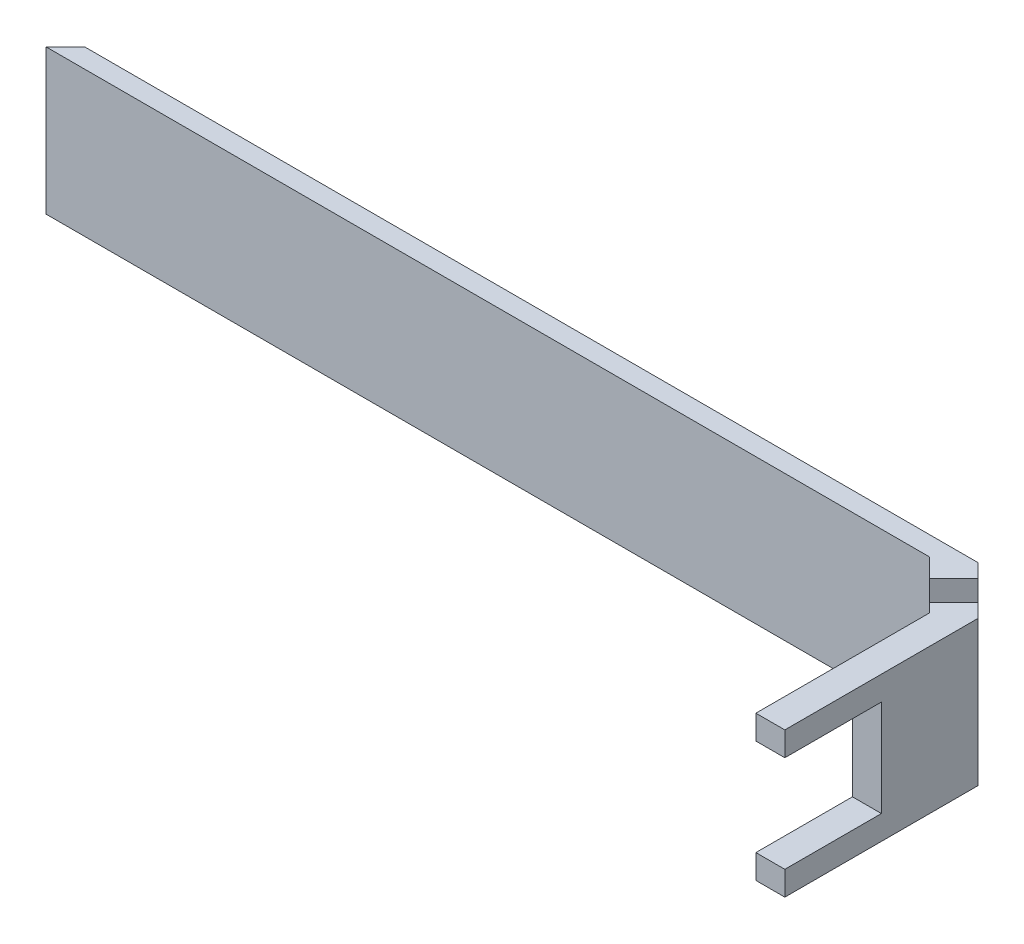
ISO-10303-21;
HEADER;
FILE_DESCRIPTION(('STEP AP214'),'2;1');
FILE_NAME('part.step','',(''),(''),'','','');
FILE_SCHEMA(('AUTOMOTIVE_DESIGN { 1 0 10303 214 1 1 1 1 }'));
ENDSEC;
DATA;
#1=APPLICATION_CONTEXT('core data for automotive mechanical design processes');
#2=APPLICATION_PROTOCOL_DEFINITION('international standard','automotive_design',2000,#1);
#3=PRODUCT_CONTEXT('',#1,'mechanical');
#4=PRODUCT('Part','Part','',(#3));
#5=PRODUCT_RELATED_PRODUCT_CATEGORY('part','',(#4));
#6=PRODUCT_DEFINITION_FORMATION('','',#4);
#7=PRODUCT_DEFINITION_CONTEXT('part definition',#1,'design');
#8=PRODUCT_DEFINITION('design','',#6,#7);
#9=PRODUCT_DEFINITION_SHAPE('','',#8);
#10=(LENGTH_UNIT() NAMED_UNIT(*) SI_UNIT(.MILLI.,.METRE.));
#11=(NAMED_UNIT(*) PLANE_ANGLE_UNIT() SI_UNIT($,.RADIAN.));
#12=(NAMED_UNIT(*) SI_UNIT($,.STERADIAN.) SOLID_ANGLE_UNIT());
#13=UNCERTAINTY_MEASURE_WITH_UNIT(LENGTH_MEASURE(1.E-05),#10,'distance_accuracy_value','');
#14=(GEOMETRIC_REPRESENTATION_CONTEXT(3) GLOBAL_UNCERTAINTY_ASSIGNED_CONTEXT((#13)) GLOBAL_UNIT_ASSIGNED_CONTEXT((#10,
#11,#12)) REPRESENTATION_CONTEXT('',''));
#15=CARTESIAN_POINT('',(0.,0.,0.));
#16=DIRECTION('',(0.,0.,1.));
#17=DIRECTION('',(1.,0.,0.));
#18=AXIS2_PLACEMENT_3D('',#15,#16,#17);
#19=CARTESIAN_POINT('',(0.,15.,0.));
#20=DIRECTION('',(0.,-1.,0.));
#21=DIRECTION('',(0.,0.,-1.));
#22=AXIS2_PLACEMENT_3D('',#19,#20,#21);
#23=PLANE('',#22);
#24=DIRECTION('',(0.707106781186544,0.,0.707106781186551));
#25=VECTOR('',#24,1.);
#26=CARTESIAN_POINT('',(46.5,15.,-13.5));
#27=LINE('',#26,#25);
#28=CARTESIAN_POINT('',(51.5,15.,-8.49999999999997));
#29=VERTEX_POINT('',#28);
#30=CARTESIAN_POINT('',(50.0606601717798,15.,-9.93933982822017));
#31=VERTEX_POINT('',#30);
#32=EDGE_CURVE('E213',#29,#31,#27,.F.);
#33=ORIENTED_EDGE('',*,*,#32,.T.);
#34=DIRECTION('',(0.707106781186551,0.,-0.707106781186544));
#35=VECTOR('',#34,1.);
#36=CARTESIAN_POINT('',(44.5606601717798,15.,-4.43933982822018));
#37=LINE('',#36,#35);
#38=CARTESIAN_POINT('',(47.5606601717798,15.,-7.43933982822017));
#39=VERTEX_POINT('',#38);
#40=EDGE_CURVE('E345',#39,#31,#37,.T.);
#41=ORIENTED_EDGE('',*,*,#40,.F.);
#42=DIRECTION('',(-0.707106781186544,0.,-0.707106781186551));
#43=VECTOR('',#42,1.);
#44=CARTESIAN_POINT('',(27.5000000000002,15.,-27.5));
#45=LINE('',#44,#43);
#46=CARTESIAN_POINT('',(48.5,15.,-6.49999999999997));
#47=VERTEX_POINT('',#46);
#48=EDGE_CURVE('E209',#39,#47,#45,.F.);
#49=ORIENTED_EDGE('',*,*,#48,.T.);
#50=DIRECTION('',(0.,0.,1.));
#51=VECTOR('',#50,1.);
#52=CARTESIAN_POINT('',(48.5,15.,11.5));
#53=LINE('',#52,#51);
#54=CARTESIAN_POINT('',(48.5,15.,11.5));
#55=VERTEX_POINT('',#54);
#56=EDGE_CURVE('E293',#47,#55,#53,.T.);
#57=ORIENTED_EDGE('',*,*,#56,.T.);
#58=DIRECTION('',(1.,0.,0.));
#59=VECTOR('',#58,1.);
#60=CARTESIAN_POINT('',(51.5,15.,11.5));
#61=LINE('',#60,#59);
#62=CARTESIAN_POINT('',(51.5,15.,11.5));
#63=VERTEX_POINT('',#62);
#64=EDGE_CURVE('E244',#55,#63,#61,.T.);
#65=ORIENTED_EDGE('',*,*,#64,.T.);
#66=DIRECTION('',(0.,0.,-1.));
#67=VECTOR('',#66,1.);
#68=CARTESIAN_POINT('',(51.5,15.,-13.5));
#69=LINE('',#68,#67);
#70=EDGE_CURVE('E239',#63,#29,#69,.T.);
#71=ORIENTED_EDGE('',*,*,#70,.T.);
#72=EDGE_LOOP('',(#33,#41,#49,#57,#65,#71));
#73=FACE_BOUND('',#72,.T.);
#74=ADVANCED_FACE('F37',(#73),#23,.F.);
#75=CARTESIAN_POINT('',(0.,0.,0.));
#76=DIRECTION('',(0.,-1.,0.));
#77=DIRECTION('',(0.,0.,-1.));
#78=AXIS2_PLACEMENT_3D('',#75,#76,#77);
#79=PLANE('',#78);
#80=DIRECTION('',(0.707106781186551,0.,-0.707106781186544));
#81=VECTOR('',#80,1.);
#82=CARTESIAN_POINT('',(44.5606601717798,0.,-4.43933982822018));
#83=LINE('',#82,#81);
#84=CARTESIAN_POINT('',(47.5606601717798,0.,-7.43933982822017));
#85=VERTEX_POINT('',#84);
#86=CARTESIAN_POINT('',(50.0606601717798,0.,-9.93933982822017));
#87=VERTEX_POINT('',#86);
#88=EDGE_CURVE('E178',#85,#87,#83,.T.);
#89=ORIENTED_EDGE('',*,*,#88,.T.);
#90=DIRECTION('',(-0.707106781186544,0.,-0.707106781186551));
#91=VECTOR('',#90,1.);
#92=CARTESIAN_POINT('',(30.0000000000002,0.,-29.9999999999999));
#93=LINE('',#92,#91);
#94=CARTESIAN_POINT('',(51.5,0.,-8.49999999999997));
#95=VERTEX_POINT('',#94);
#96=EDGE_CURVE('E193',#87,#95,#93,.F.);
#97=ORIENTED_EDGE('',*,*,#96,.T.);
#98=DIRECTION('',(0.,0.,-1.));
#99=VECTOR('',#98,1.);
#100=CARTESIAN_POINT('',(51.5,0.,-13.5));
#101=LINE('',#100,#99);
#102=CARTESIAN_POINT('',(51.5,0.,11.5));
#103=VERTEX_POINT('',#102);
#104=EDGE_CURVE('E258',#103,#95,#101,.T.);
#105=ORIENTED_EDGE('',*,*,#104,.F.);
#106=DIRECTION('',(1.,0.,0.));
#107=VECTOR('',#106,1.);
#108=CARTESIAN_POINT('',(51.5,0.,11.5));
#109=LINE('',#108,#107);
#110=CARTESIAN_POINT('',(48.5,0.,11.5));
#111=VERTEX_POINT('',#110);
#112=EDGE_CURVE('E255',#111,#103,#109,.T.);
#113=ORIENTED_EDGE('',*,*,#112,.F.);
#114=DIRECTION('',(0.,0.,1.));
#115=VECTOR('',#114,1.);
#116=CARTESIAN_POINT('',(48.5,0.,11.5));
#117=LINE('',#116,#115);
#118=CARTESIAN_POINT('',(48.5,0.,-6.49999999999997));
#119=VERTEX_POINT('',#118);
#120=EDGE_CURVE('E251',#119,#111,#117,.T.);
#121=ORIENTED_EDGE('',*,*,#120,.F.);
#122=DIRECTION('',(0.707106781186544,0.,0.707106781186551));
#123=VECTOR('',#122,1.);
#124=CARTESIAN_POINT('',(48.5,0.,-6.49999999999997));
#125=LINE('',#124,#123);
#126=EDGE_CURVE('E196',#119,#85,#125,.F.);
#127=ORIENTED_EDGE('',*,*,#126,.T.);
#128=EDGE_LOOP('',(#89,#97,#105,#113,#121,#127));
#129=FACE_BOUND('',#128,.T.);
#130=ADVANCED_FACE('F191',(#129),#79,.T.);
#131=CARTESIAN_POINT('',(51.5,15.,11.5));
#132=DIRECTION('',(0.,0.,-1.));
#133=DIRECTION('',(-1.,0.,0.));
#134=AXIS2_PLACEMENT_3D('',#131,#132,#133);
#135=PLANE('',#134);
#136=DIRECTION('',(0.,-1.,0.));
#137=VECTOR('',#136,1.);
#138=CARTESIAN_POINT('',(48.5,15.,11.5));
#139=LINE('',#138,#137);
#140=CARTESIAN_POINT('',(48.5,12.5,11.5));
#141=VERTEX_POINT('',#140);
#142=EDGE_CURVE('E264',#55,#141,#139,.T.);
#143=ORIENTED_EDGE('',*,*,#142,.T.);
#144=DIRECTION('',(1.,0.,0.));
#145=VECTOR('',#144,1.);
#146=CARTESIAN_POINT('',(27.5,12.5,11.5));
#147=LINE('',#146,#145);
#148=CARTESIAN_POINT('',(51.5,12.5,11.5));
#149=VERTEX_POINT('',#148);
#150=EDGE_CURVE('E307',#141,#149,#147,.T.);
#151=ORIENTED_EDGE('',*,*,#150,.T.);
#152=DIRECTION('',(0.,-1.,0.));
#153=VECTOR('',#152,1.);
#154=CARTESIAN_POINT('',(51.5,15.,11.5));
#155=LINE('',#154,#153);
#156=EDGE_CURVE('E241',#63,#149,#155,.T.);
#157=ORIENTED_EDGE('',*,*,#156,.F.);
#158=ORIENTED_EDGE('',*,*,#64,.F.);
#159=EDGE_LOOP('',(#143,#151,#157,#158));
#160=FACE_BOUND('',#159,.T.);
#161=ADVANCED_FACE('F306',(#160),#135,.F.);
#162=CARTESIAN_POINT('',(48.5,15.,-11.5));
#163=DIRECTION('',(0.,0.,-1.));
#164=DIRECTION('',(-1.,0.,0.));
#165=AXIS2_PLACEMENT_3D('',#162,#163,#164);
#166=PLANE('',#165);
#167=DIRECTION('',(1.,0.,0.));
#168=VECTOR('',#167,1.);
#169=CARTESIAN_POINT('',(48.5,15.,-11.5));
#170=LINE('',#169,#168);
#171=CARTESIAN_POINT('',(-47.9999999999999,15.,-11.5));
#172=VERTEX_POINT('',#171);
#173=CARTESIAN_POINT('',(43.5,15.,-11.5));
#174=VERTEX_POINT('',#173);
#175=EDGE_CURVE('E260',#172,#174,#170,.T.);
#176=ORIENTED_EDGE('',*,*,#175,.F.);
#177=DIRECTION('',(0.,1.,0.));
#178=VECTOR('',#177,1.);
#179=CARTESIAN_POINT('',(-48.,15.,-11.5));
#180=LINE('',#179,#178);
#181=CARTESIAN_POINT('',(-47.9999999999999,0.,-11.5));
#182=VERTEX_POINT('',#181);
#183=EDGE_CURVE('E216',#172,#182,#180,.F.);
#184=ORIENTED_EDGE('',*,*,#183,.T.);
#185=DIRECTION('',(1.,0.,0.));
#186=VECTOR('',#185,1.);
#187=CARTESIAN_POINT('',(48.5,0.,-11.5));
#188=LINE('',#187,#186);
#189=CARTESIAN_POINT('',(43.5,0.,-11.5));
#190=VERTEX_POINT('',#189);
#191=EDGE_CURVE('E248',#182,#190,#188,.T.);
#192=ORIENTED_EDGE('',*,*,#191,.T.);
#193=DIRECTION('',(0.,1.,0.));
#194=VECTOR('',#193,1.);
#195=CARTESIAN_POINT('',(43.5,15.,-11.5));
#196=LINE('',#195,#194);
#197=EDGE_CURVE('E270',#190,#174,#196,.T.);
#198=ORIENTED_EDGE('',*,*,#197,.T.);
#199=EDGE_LOOP('',(#176,#184,#192,#198));
#200=FACE_BOUND('',#199,.T.);
#201=ADVANCED_FACE('F284',(#200),#166,.F.);
#202=CARTESIAN_POINT('',(48.5,15.,11.5));
#203=DIRECTION('',(1.,0.,0.));
#204=DIRECTION('',(0.,0.,-1.));
#205=AXIS2_PLACEMENT_3D('',#202,#203,#204);
#206=PLANE('',#205);
#207=DIRECTION('',(0.,1.,0.));
#208=VECTOR('',#207,1.);
#209=CARTESIAN_POINT('',(48.5,15.,1.5));
#210=LINE('',#209,#208);
#211=CARTESIAN_POINT('',(48.5,2.5,1.5));
#212=VERTEX_POINT('',#211);
#213=CARTESIAN_POINT('',(48.5,12.5,1.5));
#214=VERTEX_POINT('',#213);
#215=EDGE_CURVE('E371',#212,#214,#210,.T.);
#216=ORIENTED_EDGE('',*,*,#215,.T.);
#217=DIRECTION('',(0.,0.,1.));
#218=VECTOR('',#217,1.);
#219=CARTESIAN_POINT('',(48.5,12.5,11.5));
#220=LINE('',#219,#218);
#221=EDGE_CURVE('E252',#214,#141,#220,.T.);
#222=ORIENTED_EDGE('',*,*,#221,.T.);
#223=ORIENTED_EDGE('',*,*,#142,.F.);
#224=ORIENTED_EDGE('',*,*,#56,.F.);
#225=DIRECTION('',(0.,-1.,0.));
#226=VECTOR('',#225,1.);
#227=CARTESIAN_POINT('',(48.5,0.,-6.49999999999997));
#228=LINE('',#227,#226);
#229=EDGE_CURVE('E267',#47,#119,#228,.T.);
#230=ORIENTED_EDGE('',*,*,#229,.T.);
#231=ORIENTED_EDGE('',*,*,#120,.T.);
#232=CARTESIAN_POINT('',(48.5,2.5,11.5));
#233=VERTEX_POINT('',#232);
#234=EDGE_CURVE('E263',#233,#111,#139,.T.);
#235=ORIENTED_EDGE('',*,*,#234,.F.);
#236=DIRECTION('',(0.,0.,-1.));
#237=VECTOR('',#236,1.);
#238=CARTESIAN_POINT('',(48.5,2.5,11.5));
#239=LINE('',#238,#237);
#240=EDGE_CURVE('E365',#233,#212,#239,.T.);
#241=ORIENTED_EDGE('',*,*,#240,.T.);
#242=EDGE_LOOP('',(#216,#222,#223,#224,#230,#231,#235,#241));
#243=FACE_BOUND('',#242,.T.);
#244=ADVANCED_FACE('F322',(#243),#206,.F.);
#245=CARTESIAN_POINT('',(51.5,2.5,11.5));
#246=VERTEX_POINT('',#245);
#247=EDGE_CURVE('E238',#246,#103,#155,.T.);
#248=ORIENTED_EDGE('',*,*,#247,.F.);
#249=DIRECTION('',(1.,0.,0.));
#250=VECTOR('',#249,1.);
#251=CARTESIAN_POINT('',(27.5,2.5,11.5));
#252=LINE('',#251,#250);
#253=EDGE_CURVE('E318',#233,#246,#252,.T.);
#254=ORIENTED_EDGE('',*,*,#253,.F.);
#255=ORIENTED_EDGE('',*,*,#234,.T.);
#256=ORIENTED_EDGE('',*,*,#112,.T.);
#257=EDGE_LOOP('',(#248,#254,#255,#256));
#258=FACE_BOUND('',#257,.T.);
#259=ADVANCED_FACE('F315',(#258),#135,.F.);
#260=CARTESIAN_POINT('',(51.5,15.,-13.5));
#261=DIRECTION('',(-1.,0.,0.));
#262=DIRECTION('',(0.,0.,1.));
#263=AXIS2_PLACEMENT_3D('',#260,#261,#262);
#264=PLANE('',#263);
#265=ORIENTED_EDGE('',*,*,#156,.T.);
#266=DIRECTION('',(0.,0.,1.));
#267=VECTOR('',#266,1.);
#268=CARTESIAN_POINT('',(51.5,12.5,11.5));
#269=LINE('',#268,#267);
#270=CARTESIAN_POINT('',(51.5,12.5,1.5));
#271=VERTEX_POINT('',#270);
#272=EDGE_CURVE('E362',#271,#149,#269,.T.);
#273=ORIENTED_EDGE('',*,*,#272,.F.);
#274=DIRECTION('',(0.,1.,0.));
#275=VECTOR('',#274,1.);
#276=CARTESIAN_POINT('',(51.5,12.5,1.5));
#277=LINE('',#276,#275);
#278=CARTESIAN_POINT('',(51.5,2.5,1.5));
#279=VERTEX_POINT('',#278);
#280=EDGE_CURVE('E331',#279,#271,#277,.T.);
#281=ORIENTED_EDGE('',*,*,#280,.F.);
#282=DIRECTION('',(0.,0.,-1.));
#283=VECTOR('',#282,1.);
#284=CARTESIAN_POINT('',(51.5,2.5,11.5));
#285=LINE('',#284,#283);
#286=EDGE_CURVE('E328',#246,#279,#285,.T.);
#287=ORIENTED_EDGE('',*,*,#286,.F.);
#288=ORIENTED_EDGE('',*,*,#247,.T.);
#289=ORIENTED_EDGE('',*,*,#104,.T.);
#290=DIRECTION('',(0.,1.,0.));
#291=VECTOR('',#290,1.);
#292=CARTESIAN_POINT('',(51.5,15.,-8.49999999999997));
#293=LINE('',#292,#291);
#294=EDGE_CURVE('E202',#95,#29,#293,.T.);
#295=ORIENTED_EDGE('',*,*,#294,.T.);
#296=ORIENTED_EDGE('',*,*,#70,.F.);
#297=EDGE_LOOP('',(#265,#273,#281,#287,#288,#289,#295,#296));
#298=FACE_BOUND('',#297,.T.);
#299=ADVANCED_FACE('F310',(#298),#264,.F.);
#300=CARTESIAN_POINT('',(-48.5,15.,-13.5));
#301=DIRECTION('',(0.,0.,1.));
#302=DIRECTION('',(1.,0.,0.));
#303=AXIS2_PLACEMENT_3D('',#300,#301,#302);
#304=PLANE('',#303);
#305=DIRECTION('',(-1.,0.,0.));
#306=VECTOR('',#305,1.);
#307=CARTESIAN_POINT('',(-48.5,0.,-13.5));
#308=LINE('',#307,#306);
#309=CARTESIAN_POINT('',(46.5,0.,-13.5));
#310=VERTEX_POINT('',#309);
#311=CARTESIAN_POINT('',(-46.,0.,-13.5));
#312=VERTEX_POINT('',#311);
#313=EDGE_CURVE('E230',#310,#312,#308,.T.);
#314=ORIENTED_EDGE('',*,*,#313,.T.);
#315=DIRECTION('',(0.,1.,0.));
#316=VECTOR('',#315,1.);
#317=CARTESIAN_POINT('',(-46.,15.,-13.5));
#318=LINE('',#317,#316);
#319=CARTESIAN_POINT('',(-46.,15.,-13.5));
#320=VERTEX_POINT('',#319);
#321=EDGE_CURVE('E46',#312,#320,#318,.T.);
#322=ORIENTED_EDGE('',*,*,#321,.T.);
#323=DIRECTION('',(-1.,0.,0.));
#324=VECTOR('',#323,1.);
#325=CARTESIAN_POINT('',(-48.5,15.,-13.5));
#326=LINE('',#325,#324);
#327=CARTESIAN_POINT('',(46.5,15.,-13.5));
#328=VERTEX_POINT('',#327);
#329=EDGE_CURVE('E227',#328,#320,#326,.T.);
#330=ORIENTED_EDGE('',*,*,#329,.F.);
#331=DIRECTION('',(0.,-1.,0.));
#332=VECTOR('',#331,1.);
#333=CARTESIAN_POINT('',(46.5,15.,-13.5));
#334=LINE('',#333,#332);
#335=EDGE_CURVE('E273',#328,#310,#334,.T.);
#336=ORIENTED_EDGE('',*,*,#335,.T.);
#337=EDGE_LOOP('',(#314,#322,#330,#336));
#338=FACE_BOUND('',#337,.T.);
#339=ADVANCED_FACE('F225',(#338),#304,.F.);
#340=CARTESIAN_POINT('',(45.4393398282202,15.,-9.56066017177983));
#341=VERTEX_POINT('',#340);
#342=EDGE_CURVE('E204',#174,#341,#45,.F.);
#343=ORIENTED_EDGE('',*,*,#342,.T.);
#344=DIRECTION('',(0.707106781186551,0.,-0.707106781186544));
#345=VECTOR('',#344,1.);
#346=CARTESIAN_POINT('',(42.4393398282202,15.,-6.56066017177984));
#347=LINE('',#346,#345);
#348=CARTESIAN_POINT('',(47.9393398282202,15.,-12.0606601717798));
#349=VERTEX_POINT('',#348);
#350=EDGE_CURVE('E292',#341,#349,#347,.T.);
#351=ORIENTED_EDGE('',*,*,#350,.T.);
#352=EDGE_CURVE('E207',#349,#328,#27,.F.);
#353=ORIENTED_EDGE('',*,*,#352,.T.);
#354=ORIENTED_EDGE('',*,*,#329,.T.);
#355=DIRECTION('',(0.707106781186544,0.,-0.707106781186551));
#356=VECTOR('',#355,1.);
#357=CARTESIAN_POINT('',(-48.5,15.,-11.));
#358=LINE('',#357,#356);
#359=EDGE_CURVE('E11',#320,#172,#358,.F.);
#360=ORIENTED_EDGE('',*,*,#359,.T.);
#361=ORIENTED_EDGE('',*,*,#175,.T.);
#362=EDGE_LOOP('',(#343,#351,#353,#354,#360,#361));
#363=FACE_BOUND('',#362,.T.);
#364=ADVANCED_FACE('F234',(#363),#23,.F.);
#365=DIRECTION('',(0.707106781186551,0.,-0.707106781186544));
#366=VECTOR('',#365,1.);
#367=CARTESIAN_POINT('',(42.4393398282202,0.,-6.56066017177984));
#368=LINE('',#367,#366);
#369=CARTESIAN_POINT('',(45.4393398282202,0.,-9.56066017177983));
#370=VERTEX_POINT('',#369);
#371=CARTESIAN_POINT('',(47.9393398282202,0.,-12.0606601717798));
#372=VERTEX_POINT('',#371);
#373=EDGE_CURVE('E61',#370,#372,#368,.T.);
#374=ORIENTED_EDGE('',*,*,#373,.F.);
#375=EDGE_CURVE('E275',#370,#190,#125,.F.);
#376=ORIENTED_EDGE('',*,*,#375,.T.);
#377=ORIENTED_EDGE('',*,*,#191,.F.);
#378=DIRECTION('',(-0.707106781186544,0.,0.707106781186551));
#379=VECTOR('',#378,1.);
#380=CARTESIAN_POINT('',(-29.7500000000003,0.,-29.7499999999999));
#381=LINE('',#380,#379);
#382=EDGE_CURVE('E218',#182,#312,#381,.F.);
#383=ORIENTED_EDGE('',*,*,#382,.T.);
#384=ORIENTED_EDGE('',*,*,#313,.F.);
#385=EDGE_CURVE('E203',#310,#372,#93,.F.);
#386=ORIENTED_EDGE('',*,*,#385,.T.);
#387=EDGE_LOOP('',(#374,#376,#377,#383,#384,#386));
#388=FACE_BOUND('',#387,.T.);
#389=ADVANCED_FACE('F279',(#388),#79,.T.);
#390=CARTESIAN_POINT('',(48.5,15.,-6.49999999999997));
#391=DIRECTION('',(-0.707106781186551,0.,0.707106781186544));
#392=DIRECTION('',(0.,1.,0.));
#393=AXIS2_PLACEMENT_3D('',#390,#391,#392);
#394=PLANE('',#393);
#395=DIRECTION('',(0.707106781186544,0.,0.707106781186551));
#396=VECTOR('',#395,1.);
#397=CARTESIAN_POINT('',(47.5606601717798,3.,-7.43933982822017));
#398=LINE('',#397,#396);
#399=CARTESIAN_POINT('',(47.5606601717798,3.,-7.43933982822017));
#400=VERTEX_POINT('',#399);
#401=CARTESIAN_POINT('',(45.4393398282202,3.,-9.56066017177983));
#402=VERTEX_POINT('',#401);
#403=EDGE_CURVE('E327',#400,#402,#398,.F.);
#404=ORIENTED_EDGE('',*,*,#403,.F.);
#405=DIRECTION('',(0.,-1.,0.));
#406=VECTOR('',#405,1.);
#407=CARTESIAN_POINT('',(47.5606601717798,3.,-7.43933982822017));
#408=LINE('',#407,#406);
#409=EDGE_CURVE('E326',#85,#400,#408,.F.);
#410=ORIENTED_EDGE('',*,*,#409,.F.);
#411=ORIENTED_EDGE('',*,*,#126,.F.);
#412=ORIENTED_EDGE('',*,*,#229,.F.);
#413=ORIENTED_EDGE('',*,*,#48,.F.);
#414=DIRECTION('',(0.,-1.,0.));
#415=VECTOR('',#414,1.);
#416=CARTESIAN_POINT('',(47.5606601717798,15.,-7.43933982822017));
#417=LINE('',#416,#415);
#418=CARTESIAN_POINT('',(47.5606601717798,12.,-7.43933982822017));
#419=VERTEX_POINT('',#418);
#420=EDGE_CURVE('E344',#419,#39,#417,.F.);
#421=ORIENTED_EDGE('',*,*,#420,.F.);
#422=DIRECTION('',(-0.707106781186544,0.,-0.707106781186551));
#423=VECTOR('',#422,1.);
#424=CARTESIAN_POINT('',(47.5606601717798,12.,-7.43933982822017));
#425=LINE('',#424,#423);
#426=CARTESIAN_POINT('',(45.4393398282202,12.,-9.56066017177983));
#427=VERTEX_POINT('',#426);
#428=EDGE_CURVE('E187',#427,#419,#425,.F.);
#429=ORIENTED_EDGE('',*,*,#428,.F.);
#430=DIRECTION('',(0.,1.,0.));
#431=VECTOR('',#430,1.);
#432=CARTESIAN_POINT('',(45.4393398282202,15.,-9.56066017177983));
#433=LINE('',#432,#431);
#434=EDGE_CURVE('E291',#341,#427,#433,.F.);
#435=ORIENTED_EDGE('',*,*,#434,.F.);
#436=ORIENTED_EDGE('',*,*,#342,.F.);
#437=ORIENTED_EDGE('',*,*,#197,.F.);
#438=ORIENTED_EDGE('',*,*,#375,.F.);
#439=DIRECTION('',(0.,1.,0.));
#440=VECTOR('',#439,1.);
#441=CARTESIAN_POINT('',(45.4393398282202,3.,-9.56066017177983));
#442=LINE('',#441,#440);
#443=EDGE_CURVE('E333',#402,#370,#442,.F.);
#444=ORIENTED_EDGE('',*,*,#443,.F.);
#445=EDGE_LOOP('',(#404,#410,#411,#412,#413,#421,#429,#435,#436,#437,#438,#444));
#446=FACE_BOUND('',#445,.T.);
#447=ADVANCED_FACE('F288',(#446),#394,.T.);
#448=CARTESIAN_POINT('',(46.5,15.,-13.5));
#449=DIRECTION('',(-0.707106781186551,0.,0.707106781186544));
#450=DIRECTION('',(0.,-1.,0.));
#451=AXIS2_PLACEMENT_3D('',#448,#449,#450);
#452=PLANE('',#451);
#453=DIRECTION('',(0.,-1.,0.));
#454=VECTOR('',#453,1.);
#455=CARTESIAN_POINT('',(50.0606601717798,3.,-9.93933982822017));
#456=LINE('',#455,#454);
#457=CARTESIAN_POINT('',(50.0606601717798,3.,-9.93933982822017));
#458=VERTEX_POINT('',#457);
#459=EDGE_CURVE('E175',#458,#87,#456,.T.);
#460=ORIENTED_EDGE('',*,*,#459,.F.);
#461=DIRECTION('',(0.707106781186545,0.,0.70710678118655));
#462=VECTOR('',#461,1.);
#463=CARTESIAN_POINT('',(50.0606601717798,3.,-9.93933982822017));
#464=LINE('',#463,#462);
#465=CARTESIAN_POINT('',(47.9393398282202,3.,-12.0606601717798));
#466=VERTEX_POINT('',#465);
#467=EDGE_CURVE('E197',#466,#458,#464,.T.);
#468=ORIENTED_EDGE('',*,*,#467,.F.);
#469=DIRECTION('',(0.,1.,0.));
#470=VECTOR('',#469,1.);
#471=CARTESIAN_POINT('',(47.9393398282202,3.,-12.0606601717798));
#472=LINE('',#471,#470);
#473=EDGE_CURVE('E186',#372,#466,#472,.T.);
#474=ORIENTED_EDGE('',*,*,#473,.F.);
#475=ORIENTED_EDGE('',*,*,#385,.F.);
#476=ORIENTED_EDGE('',*,*,#335,.F.);
#477=ORIENTED_EDGE('',*,*,#352,.F.);
#478=DIRECTION('',(0.,1.,0.));
#479=VECTOR('',#478,1.);
#480=CARTESIAN_POINT('',(47.9393398282202,15.,-12.0606601717798));
#481=LINE('',#480,#479);
#482=CARTESIAN_POINT('',(47.9393398282202,12.,-12.0606601717798));
#483=VERTEX_POINT('',#482);
#484=EDGE_CURVE('E351',#483,#349,#481,.T.);
#485=ORIENTED_EDGE('',*,*,#484,.F.);
#486=DIRECTION('',(-0.707106781186544,0.,-0.707106781186551));
#487=VECTOR('',#486,1.);
#488=CARTESIAN_POINT('',(50.0606601717798,12.,-9.93933982822017));
#489=LINE('',#488,#487);
#490=CARTESIAN_POINT('',(50.0606601717798,12.,-9.93933982822015));
#491=VERTEX_POINT('',#490);
#492=EDGE_CURVE('E348',#491,#483,#489,.T.);
#493=ORIENTED_EDGE('',*,*,#492,.F.);
#494=DIRECTION('',(0.,-1.,0.));
#495=VECTOR('',#494,1.);
#496=CARTESIAN_POINT('',(50.0606601717798,15.,-9.93933982822017));
#497=LINE('',#496,#495);
#498=EDGE_CURVE('E53',#31,#491,#497,.T.);
#499=ORIENTED_EDGE('',*,*,#498,.F.);
#500=ORIENTED_EDGE('',*,*,#32,.F.);
#501=ORIENTED_EDGE('',*,*,#294,.F.);
#502=ORIENTED_EDGE('',*,*,#96,.F.);
#503=EDGE_LOOP('',(#460,#468,#474,#475,#476,#477,#485,#493,#499,#500,#501,#502));
#504=FACE_BOUND('',#503,.T.);
#505=ADVANCED_FACE('F200',(#504),#452,.F.);
#506=CARTESIAN_POINT('',(27.5,12.5,11.5));
#507=DIRECTION('',(0.,1.,0.));
#508=DIRECTION('',(0.,0.,1.));
#509=AXIS2_PLACEMENT_3D('',#506,#507,#508);
#510=PLANE('',#509);
#511=DIRECTION('',(1.,0.,0.));
#512=VECTOR('',#511,1.);
#513=CARTESIAN_POINT('',(27.5,12.5,1.5));
#514=LINE('',#513,#512);
#515=EDGE_CURVE('E366',#214,#271,#514,.T.);
#516=ORIENTED_EDGE('',*,*,#515,.T.);
#517=ORIENTED_EDGE('',*,*,#272,.T.);
#518=ORIENTED_EDGE('',*,*,#150,.F.);
#519=ORIENTED_EDGE('',*,*,#221,.F.);
#520=EDGE_LOOP('',(#516,#517,#518,#519));
#521=FACE_BOUND('',#520,.T.);
#522=ADVANCED_FACE('F375',(#521),#510,.F.);
#523=CARTESIAN_POINT('',(27.5,12.5,1.5));
#524=DIRECTION('',(0.,0.,-1.));
#525=DIRECTION('',(-1.,0.,0.));
#526=AXIS2_PLACEMENT_3D('',#523,#524,#525);
#527=PLANE('',#526);
#528=DIRECTION('',(1.,0.,0.));
#529=VECTOR('',#528,1.);
#530=CARTESIAN_POINT('',(27.5,2.5,1.5));
#531=LINE('',#530,#529);
#532=EDGE_CURVE('E368',#212,#279,#531,.T.);
#533=ORIENTED_EDGE('',*,*,#532,.T.);
#534=ORIENTED_EDGE('',*,*,#280,.T.);
#535=ORIENTED_EDGE('',*,*,#515,.F.);
#536=ORIENTED_EDGE('',*,*,#215,.F.);
#537=EDGE_LOOP('',(#533,#534,#535,#536));
#538=FACE_BOUND('',#537,.T.);
#539=ADVANCED_FACE('F377',(#538),#527,.F.);
#540=CARTESIAN_POINT('',(27.5,2.5,11.5));
#541=DIRECTION('',(0.,-1.,0.));
#542=DIRECTION('',(0.,0.,-1.));
#543=AXIS2_PLACEMENT_3D('',#540,#541,#542);
#544=PLANE('',#543);
#545=ORIENTED_EDGE('',*,*,#253,.T.);
#546=ORIENTED_EDGE('',*,*,#286,.T.);
#547=ORIENTED_EDGE('',*,*,#532,.F.);
#548=ORIENTED_EDGE('',*,*,#240,.F.);
#549=EDGE_LOOP('',(#545,#546,#547,#548));
#550=FACE_BOUND('',#549,.T.);
#551=ADVANCED_FACE('F381',(#550),#544,.F.);
#552=CARTESIAN_POINT('',(-48.5,15.,-11.));
#553=DIRECTION('',(0.707106781186551,0.,0.707106781186544));
#554=DIRECTION('',(0.,-1.,0.));
#555=AXIS2_PLACEMENT_3D('',#552,#553,#554);
#556=PLANE('',#555);
#557=ORIENTED_EDGE('',*,*,#359,.F.);
#558=ORIENTED_EDGE('',*,*,#321,.F.);
#559=ORIENTED_EDGE('',*,*,#382,.F.);
#560=ORIENTED_EDGE('',*,*,#183,.F.);
#561=EDGE_LOOP('',(#557,#558,#559,#560));
#562=FACE_BOUND('',#561,.T.);
#563=ADVANCED_FACE('F40',(#562),#556,.F.);
#564=CARTESIAN_POINT('',(44.5606601717798,15.,-4.43933982822018));
#565=DIRECTION('',(0.707106781186544,0.,0.707106781186551));
#566=DIRECTION('',(0.707106781186551,0.,-0.707106781186544));
#567=AXIS2_PLACEMENT_3D('',#564,#565,#566);
#568=PLANE('',#567);
#569=ORIENTED_EDGE('',*,*,#420,.T.);
#570=ORIENTED_EDGE('',*,*,#40,.T.);
#571=ORIENTED_EDGE('',*,*,#498,.T.);
#572=DIRECTION('',(0.707106781186551,0.,-0.707106781186544));
#573=VECTOR('',#572,1.);
#574=CARTESIAN_POINT('',(44.5606601717798,12.,-4.43933982822018));
#575=LINE('',#574,#573);
#576=EDGE_CURVE('E353',#419,#491,#575,.T.);
#577=ORIENTED_EDGE('',*,*,#576,.F.);
#578=EDGE_LOOP('',(#569,#570,#571,#577));
#579=FACE_BOUND('',#578,.T.);
#580=ADVANCED_FACE('F388',(#579),#568,.F.);
#581=CARTESIAN_POINT('',(42.4393398282202,15.,-6.56066017177984));
#582=DIRECTION('',(-0.707106781186544,0.,-0.707106781186551));
#583=DIRECTION('',(-0.707106781186551,0.,0.707106781186544));
#584=AXIS2_PLACEMENT_3D('',#581,#582,#583);
#585=PLANE('',#584);
#586=ORIENTED_EDGE('',*,*,#434,.T.);
#587=DIRECTION('',(0.707106781186551,0.,-0.707106781186544));
#588=VECTOR('',#587,1.);
#589=CARTESIAN_POINT('',(42.4393398282202,12.,-6.56066017177984));
#590=LINE('',#589,#588);
#591=EDGE_CURVE('E356',#427,#483,#590,.T.);
#592=ORIENTED_EDGE('',*,*,#591,.T.);
#593=ORIENTED_EDGE('',*,*,#484,.T.);
#594=ORIENTED_EDGE('',*,*,#350,.F.);
#595=EDGE_LOOP('',(#586,#592,#593,#594));
#596=FACE_BOUND('',#595,.T.);
#597=ADVANCED_FACE('F432',(#596),#585,.F.);
#598=CARTESIAN_POINT('',(44.5606601717798,12.,-4.43933982822018));
#599=DIRECTION('',(0.,-1.,0.));
#600=DIRECTION('',(0.,0.,-1.));
#601=AXIS2_PLACEMENT_3D('',#598,#599,#600);
#602=PLANE('',#601);
#603=ORIENTED_EDGE('',*,*,#428,.T.);
#604=ORIENTED_EDGE('',*,*,#576,.T.);
#605=ORIENTED_EDGE('',*,*,#492,.T.);
#606=ORIENTED_EDGE('',*,*,#591,.F.);
#607=EDGE_LOOP('',(#603,#604,#605,#606));
#608=FACE_BOUND('',#607,.T.);
#609=ADVANCED_FACE('F433',(#608),#602,.F.);
#610=CARTESIAN_POINT('',(44.5606601717798,3.,-4.43933982822018));
#611=DIRECTION('',(0.707106781186544,0.,0.707106781186551));
#612=DIRECTION('',(0.707106781186551,0.,-0.707106781186544));
#613=AXIS2_PLACEMENT_3D('',#610,#611,#612);
#614=PLANE('',#613);
#615=ORIENTED_EDGE('',*,*,#409,.T.);
#616=DIRECTION('',(0.707106781186551,0.,-0.707106781186544));
#617=VECTOR('',#616,1.);
#618=CARTESIAN_POINT('',(44.5606601717798,3.,-4.43933982822018));
#619=LINE('',#618,#617);
#620=EDGE_CURVE('E181',#400,#458,#619,.T.);
#621=ORIENTED_EDGE('',*,*,#620,.T.);
#622=ORIENTED_EDGE('',*,*,#459,.T.);
#623=ORIENTED_EDGE('',*,*,#88,.F.);
#624=EDGE_LOOP('',(#615,#621,#622,#623));
#625=FACE_BOUND('',#624,.T.);
#626=ADVANCED_FACE('F177',(#625),#614,.F.);
#627=CARTESIAN_POINT('',(44.5606601717798,3.,-4.43933982822018));
#628=DIRECTION('',(0.,1.,0.));
#629=DIRECTION('',(0.,0.,1.));
#630=AXIS2_PLACEMENT_3D('',#627,#628,#629);
#631=PLANE('',#630);
#632=ORIENTED_EDGE('',*,*,#403,.T.);
#633=DIRECTION('',(0.707106781186551,0.,-0.707106781186544));
#634=VECTOR('',#633,1.);
#635=CARTESIAN_POINT('',(42.4393398282201,3.,-6.56066017177984));
#636=LINE('',#635,#634);
#637=EDGE_CURVE('E340',#402,#466,#636,.T.);
#638=ORIENTED_EDGE('',*,*,#637,.T.);
#639=ORIENTED_EDGE('',*,*,#467,.T.);
#640=ORIENTED_EDGE('',*,*,#620,.F.);
#641=EDGE_LOOP('',(#632,#638,#639,#640));
#642=FACE_BOUND('',#641,.T.);
#643=ADVANCED_FACE('F442',(#642),#631,.F.);
#644=CARTESIAN_POINT('',(42.4393398282201,3.,-6.56066017177984));
#645=DIRECTION('',(-0.707106781186544,0.,-0.707106781186551));
#646=DIRECTION('',(-0.707106781186551,0.,0.707106781186544));
#647=AXIS2_PLACEMENT_3D('',#644,#645,#646);
#648=PLANE('',#647);
#649=ORIENTED_EDGE('',*,*,#443,.T.);
#650=ORIENTED_EDGE('',*,*,#373,.T.);
#651=ORIENTED_EDGE('',*,*,#473,.T.);
#652=ORIENTED_EDGE('',*,*,#637,.F.);
#653=EDGE_LOOP('',(#649,#650,#651,#652));
#654=FACE_BOUND('',#653,.T.);
#655=ADVANCED_FACE('F443',(#654),#648,.F.);
#656=CLOSED_SHELL('',(#74,#130,#161,#201,#244,#259,#299,#339,#364,#389,#447,#505,#522,#539,#551,
#563,#580,#597,#609,#626,#643,#655));
#657=MANIFOLD_SOLID_BREP('B2',#656);
#658=ADVANCED_BREP_SHAPE_REPRESENTATION('',(#18,#657),#14);
#659=SHAPE_DEFINITION_REPRESENTATION(#9,#658);
ENDSEC;
END-ISO-10303-21;
